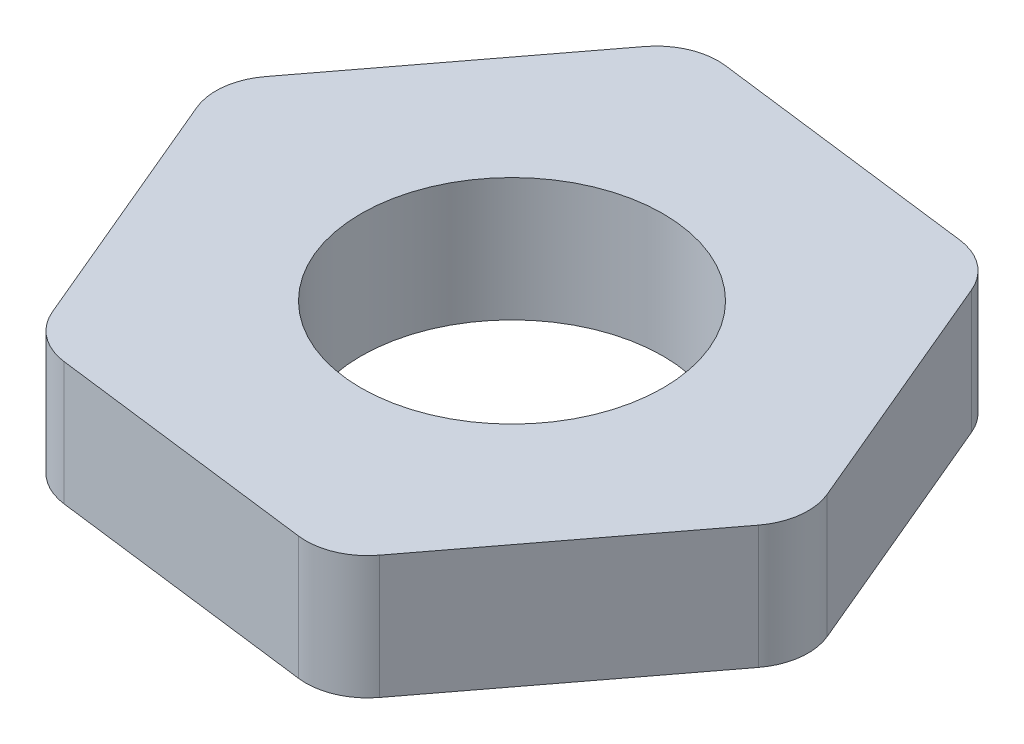
ISO-10303-21;
HEADER;
FILE_DESCRIPTION(('STEP AP214'),'2;1');
FILE_NAME('part.step','',(''),(''),'','','');
FILE_SCHEMA(('AUTOMOTIVE_DESIGN { 1 0 10303 214 1 1 1 1 }'));
ENDSEC;
DATA;
#1=APPLICATION_CONTEXT('core data for automotive mechanical design processes');
#2=APPLICATION_PROTOCOL_DEFINITION('international standard','automotive_design',2000,#1);
#3=PRODUCT_CONTEXT('',#1,'mechanical');
#4=PRODUCT('Part','Part','',(#3));
#5=PRODUCT_RELATED_PRODUCT_CATEGORY('part','',(#4));
#6=PRODUCT_DEFINITION_FORMATION('','',#4);
#7=PRODUCT_DEFINITION_CONTEXT('part definition',#1,'design');
#8=PRODUCT_DEFINITION('design','',#6,#7);
#9=PRODUCT_DEFINITION_SHAPE('','',#8);
#10=(LENGTH_UNIT() NAMED_UNIT(*) SI_UNIT(.MILLI.,.METRE.));
#11=(NAMED_UNIT(*) PLANE_ANGLE_UNIT() SI_UNIT($,.RADIAN.));
#12=(NAMED_UNIT(*) SI_UNIT($,.STERADIAN.) SOLID_ANGLE_UNIT());
#13=UNCERTAINTY_MEASURE_WITH_UNIT(LENGTH_MEASURE(1.E-05),#10,'distance_accuracy_value','');
#14=(GEOMETRIC_REPRESENTATION_CONTEXT(3) GLOBAL_UNCERTAINTY_ASSIGNED_CONTEXT((#13)) GLOBAL_UNIT_ASSIGNED_CONTEXT((#10,
#11,#12)) REPRESENTATION_CONTEXT('',''));
#15=CARTESIAN_POINT('',(0.,0.,0.));
#16=DIRECTION('',(0.,0.,1.));
#17=DIRECTION('',(1.,0.,0.));
#18=AXIS2_PLACEMENT_3D('',#15,#16,#17);
#19=CARTESIAN_POINT('',(0.,1.,0.));
#20=DIRECTION('',(0.,1.,0.));
#21=DIRECTION('',(0.,0.,1.));
#22=AXIS2_PLACEMENT_3D('',#19,#20,#21);
#23=PLANE('',#22);
#24=DIRECTION('',(-0.992143868221456,0.,-0.125102137274172));
#25=VECTOR('',#24,1.);
#26=CARTESIAN_POINT('',(1.675,1.,-2.20779867741604));
#27=LINE('',#26,#25);
#28=CARTESIAN_POINT('',(1.38859273530375,1.,-2.24391255373176));
#29=VERTEX_POINT('',#28);
#30=CARTESIAN_POINT('',(-0.788102476387726,1.,-2.51837801373123));
#31=VERTEX_POINT('',#30);
#32=EDGE_CURVE('E168',#29,#31,#27,.T.);
#33=ORIENTED_EDGE('',*,*,#32,.T.);
#34=CARTESIAN_POINT('',(-0.850653545024812,1.,-2.0223060796205));
#35=DIRECTION('',(0.,1.,0.));
#36=DIRECTION('',(0.,0.,1.));
#37=AXIS2_PLACEMENT_3D('',#34,#35,#36);
#38=CIRCLE('',#37,0.5);
#39=CARTESIAN_POINT('',(-1.24898890775064,1.,-2.32451286114945));
#40=VERTEX_POINT('',#39);
#41=EDGE_CURVE('E191',#31,#40,#38,.T.);
#42=ORIENTED_EDGE('',*,*,#41,.T.);
#43=DIRECTION('',(-0.604413563057889,0.,0.796670725451656));
#44=VECTOR('',#43,1.);
#45=CARTESIAN_POINT('',(-1.07450974108397,1.,-2.55449189004695));
#46=LINE('',#45,#44);
#47=CARTESIAN_POINT('',(-2.57503057441731,1.,-0.576672241528419));
#48=VERTEX_POINT('',#47);
#49=EDGE_CURVE('E144',#40,#48,#46,.T.);
#50=ORIENTED_EDGE('',*,*,#49,.T.);
#51=CARTESIAN_POINT('',(-2.17669521169148,1.,-0.274465459999475));
#52=DIRECTION('',(0.,1.,0.));
#53=DIRECTION('',(0.,0.,1.));
#54=AXIS2_PLACEMENT_3D('',#51,#52,#53);
#55=CIRCLE('',#54,0.5);
#56=CARTESIAN_POINT('',(-2.63758164305439,1.,-0.0806003074176914));
#57=VERTEX_POINT('',#56);
#58=EDGE_CURVE('E189',#48,#57,#55,.T.);
#59=ORIENTED_EDGE('',*,*,#58,.T.);
#60=DIRECTION('',(0.387730305163567,0.,0.921772862725827));
#61=VECTOR('',#60,1.);
#62=CARTESIAN_POINT('',(-2.74950974108397,1.,-0.346693212630916));
#63=LINE('',#62,#61);
#64=CARTESIAN_POINT('',(-1.78692809802958,1.,1.94170577220281));
#65=VERTEX_POINT('',#64);
#66=EDGE_CURVE('E228',#57,#65,#63,.T.);
#67=ORIENTED_EDGE('',*,*,#66,.T.);
#68=CARTESIAN_POINT('',(-1.32604166666667,1.,1.74784061962103));
#69=DIRECTION('',(0.,1.,0.));
#70=DIRECTION('',(0.,0.,1.));
#71=AXIS2_PLACEMENT_3D('',#68,#69,#70);
#72=CIRCLE('',#71,0.5);
#73=CARTESIAN_POINT('',(-1.38859273530375,1.,2.24391255373176));
#74=VERTEX_POINT('',#73);
#75=EDGE_CURVE('E187',#65,#74,#72,.T.);
#76=ORIENTED_EDGE('',*,*,#75,.T.);
#77=DIRECTION('',(0.992143868221456,0.,0.125102137274173));
#78=VECTOR('',#77,1.);
#79=CARTESIAN_POINT('',(-1.675,1.,2.20779867741604));
#80=LINE('',#79,#78);
#81=CARTESIAN_POINT('',(0.788102476387726,1.,2.51837801373123));
#82=VERTEX_POINT('',#81);
#83=EDGE_CURVE('E223',#74,#82,#80,.T.);
#84=ORIENTED_EDGE('',*,*,#83,.T.);
#85=CARTESIAN_POINT('',(0.850653545024812,1.,2.0223060796205));
#86=DIRECTION('',(0.,1.,0.));
#87=DIRECTION('',(0.,0.,1.));
#88=AXIS2_PLACEMENT_3D('',#85,#86,#87);
#89=CIRCLE('',#88,0.5);
#90=CARTESIAN_POINT('',(1.24898890775064,1.,2.32451286114945));
#91=VERTEX_POINT('',#90);
#92=EDGE_CURVE('E185',#82,#91,#89,.T.);
#93=ORIENTED_EDGE('',*,*,#92,.T.);
#94=DIRECTION('',(0.604413563057889,0.,-0.796670725451655));
#95=VECTOR('',#94,1.);
#96=CARTESIAN_POINT('',(1.07450974108397,1.,2.55449189004695));
#97=LINE('',#96,#95);
#98=CARTESIAN_POINT('',(2.57503057441731,1.,0.57667224152842));
#99=VERTEX_POINT('',#98);
#100=EDGE_CURVE('E213',#91,#99,#97,.T.);
#101=ORIENTED_EDGE('',*,*,#100,.T.);
#102=CARTESIAN_POINT('',(2.17669521169148,1.,0.274465459999475));
#103=DIRECTION('',(0.,1.,0.));
#104=DIRECTION('',(0.,0.,1.));
#105=AXIS2_PLACEMENT_3D('',#102,#103,#104);
#106=CIRCLE('',#105,0.5);
#107=CARTESIAN_POINT('',(2.63758164305439,1.,0.0806003074176915));
#108=VERTEX_POINT('',#107);
#109=EDGE_CURVE('E55',#99,#108,#106,.T.);
#110=ORIENTED_EDGE('',*,*,#109,.T.);
#111=DIRECTION('',(-0.387730305163567,0.,-0.921772862725828));
#112=VECTOR('',#111,1.);
#113=CARTESIAN_POINT('',(2.74950974108397,1.,0.346693212630916));
#114=LINE('',#113,#112);
#115=CARTESIAN_POINT('',(1.78692809802958,1.,-1.94170577220281));
#116=VERTEX_POINT('',#115);
#117=EDGE_CURVE('E169',#108,#116,#114,.T.);
#118=ORIENTED_EDGE('',*,*,#117,.T.);
#119=CARTESIAN_POINT('',(1.32604166666667,1.,-1.74784061962103));
#120=DIRECTION('',(0.,1.,0.));
#121=DIRECTION('',(0.,0.,1.));
#122=AXIS2_PLACEMENT_3D('',#119,#120,#121);
#123=CIRCLE('',#122,0.5);
#124=EDGE_CURVE('E182',#116,#29,#123,.T.);
#125=ORIENTED_EDGE('',*,*,#124,.T.);
#126=EDGE_LOOP('',(#33,#42,#50,#59,#67,#76,#84,#93,#101,#110,#118,#125));
#127=FACE_BOUND('',#126,.T.);
#128=CARTESIAN_POINT('',(0.,1.,0.));
#129=DIRECTION('',(0.,1.,0.));
#130=DIRECTION('',(0.,0.,1.));
#131=AXIS2_PLACEMENT_3D('',#128,#129,#130);
#132=CIRCLE('',#131,1.225);
#133=CARTESIAN_POINT('',(0.,1.,1.225));
#134=VERTEX_POINT('',#133);
#135=EDGE_CURVE('E157',#134,#134,#132,.T.);
#136=ORIENTED_EDGE('',*,*,#135,.F.);
#137=EDGE_LOOP('',(#136));
#138=FACE_BOUND('',#137,.T.);
#139=ADVANCED_FACE('F34',(#127,#138),#23,.T.);
#140=CARTESIAN_POINT('',(0.,0.,0.));
#141=DIRECTION('',(0.,1.,0.));
#142=DIRECTION('',(0.,0.,1.));
#143=AXIS2_PLACEMENT_3D('',#140,#141,#142);
#144=PLANE('',#143);
#145=DIRECTION('',(-0.604413563057889,0.,0.796670725451656));
#146=VECTOR('',#145,1.);
#147=CARTESIAN_POINT('',(-1.07450974108397,0.,-2.55449189004695));
#148=LINE('',#147,#146);
#149=CARTESIAN_POINT('',(-1.24898890775064,0.,-2.32451286114945));
#150=VERTEX_POINT('',#149);
#151=CARTESIAN_POINT('',(-2.57503057441731,0.,-0.576672241528419));
#152=VERTEX_POINT('',#151);
#153=EDGE_CURVE('E141',#150,#152,#148,.T.);
#154=ORIENTED_EDGE('',*,*,#153,.F.);
#155=CARTESIAN_POINT('',(-0.850653545024812,0.,-2.0223060796205));
#156=DIRECTION('',(0.,1.,0.));
#157=DIRECTION('',(0.,0.,1.));
#158=AXIS2_PLACEMENT_3D('',#155,#156,#157);
#159=CIRCLE('',#158,0.5);
#160=CARTESIAN_POINT('',(-0.788102476387726,0.,-2.51837801373123));
#161=VERTEX_POINT('',#160);
#162=EDGE_CURVE('E124',#150,#161,#159,.F.);
#163=ORIENTED_EDGE('',*,*,#162,.T.);
#164=DIRECTION('',(-0.992143868221456,0.,-0.125102137274172));
#165=VECTOR('',#164,1.);
#166=CARTESIAN_POINT('',(1.675,0.,-2.20779867741604));
#167=LINE('',#166,#165);
#168=CARTESIAN_POINT('',(1.38859273530375,0.,-2.24391255373176));
#169=VERTEX_POINT('',#168);
#170=EDGE_CURVE('E152',#169,#161,#167,.T.);
#171=ORIENTED_EDGE('',*,*,#170,.F.);
#172=CARTESIAN_POINT('',(1.32604166666667,0.,-1.74784061962103));
#173=DIRECTION('',(0.,1.,0.));
#174=DIRECTION('',(0.,0.,1.));
#175=AXIS2_PLACEMENT_3D('',#172,#173,#174);
#176=CIRCLE('',#175,0.5);
#177=CARTESIAN_POINT('',(1.78692809802958,0.,-1.94170577220281));
#178=VERTEX_POINT('',#177);
#179=EDGE_CURVE('E145',#169,#178,#176,.F.);
#180=ORIENTED_EDGE('',*,*,#179,.T.);
#181=DIRECTION('',(-0.387730305163567,0.,-0.921772862725828));
#182=VECTOR('',#181,1.);
#183=CARTESIAN_POINT('',(2.74950974108397,0.,0.346693212630916));
#184=LINE('',#183,#182);
#185=CARTESIAN_POINT('',(2.63758164305439,0.,0.0806003074176915));
#186=VERTEX_POINT('',#185);
#187=EDGE_CURVE('E166',#186,#178,#184,.T.);
#188=ORIENTED_EDGE('',*,*,#187,.F.);
#189=CARTESIAN_POINT('',(2.17669521169148,0.,0.274465459999475));
#190=DIRECTION('',(0.,1.,0.));
#191=DIRECTION('',(0.,0.,1.));
#192=AXIS2_PLACEMENT_3D('',#189,#190,#191);
#193=CIRCLE('',#192,0.5);
#194=CARTESIAN_POINT('',(2.57503057441731,0.,0.57667224152842));
#195=VERTEX_POINT('',#194);
#196=EDGE_CURVE('E172',#186,#195,#193,.F.);
#197=ORIENTED_EDGE('',*,*,#196,.T.);
#198=DIRECTION('',(0.604413563057889,0.,-0.796670725451655));
#199=VECTOR('',#198,1.);
#200=CARTESIAN_POINT('',(1.07450974108397,0.,2.55449189004695));
#201=LINE('',#200,#199);
#202=CARTESIAN_POINT('',(1.24898890775064,0.,2.32451286114945));
#203=VERTEX_POINT('',#202);
#204=EDGE_CURVE('E163',#203,#195,#201,.T.);
#205=ORIENTED_EDGE('',*,*,#204,.F.);
#206=CARTESIAN_POINT('',(0.850653545024812,0.,2.0223060796205));
#207=DIRECTION('',(0.,1.,0.));
#208=DIRECTION('',(0.,0.,1.));
#209=AXIS2_PLACEMENT_3D('',#206,#207,#208);
#210=CIRCLE('',#209,0.5);
#211=CARTESIAN_POINT('',(0.788102476387726,0.,2.51837801373123));
#212=VERTEX_POINT('',#211);
#213=EDGE_CURVE('E174',#203,#212,#210,.F.);
#214=ORIENTED_EDGE('',*,*,#213,.T.);
#215=DIRECTION('',(0.992143868221456,0.,0.125102137274173));
#216=VECTOR('',#215,1.);
#217=CARTESIAN_POINT('',(-1.675,0.,2.20779867741604));
#218=LINE('',#217,#216);
#219=CARTESIAN_POINT('',(-1.38859273530375,0.,2.24391255373176));
#220=VERTEX_POINT('',#219);
#221=EDGE_CURVE('E155',#220,#212,#218,.T.);
#222=ORIENTED_EDGE('',*,*,#221,.F.);
#223=CARTESIAN_POINT('',(-1.32604166666667,0.,1.74784061962103));
#224=DIRECTION('',(0.,1.,0.));
#225=DIRECTION('',(0.,0.,1.));
#226=AXIS2_PLACEMENT_3D('',#223,#224,#225);
#227=CIRCLE('',#226,0.5);
#228=CARTESIAN_POINT('',(-1.78692809802958,0.,1.94170577220281));
#229=VERTEX_POINT('',#228);
#230=EDGE_CURVE('E176',#220,#229,#227,.F.);
#231=ORIENTED_EDGE('',*,*,#230,.T.);
#232=DIRECTION('',(0.387730305163567,0.,0.921772862725827));
#233=VECTOR('',#232,1.);
#234=CARTESIAN_POINT('',(-2.74950974108397,0.,-0.346693212630916));
#235=LINE('',#234,#233);
#236=CARTESIAN_POINT('',(-2.63758164305439,0.,-0.0806003074176914));
#237=VERTEX_POINT('',#236);
#238=EDGE_CURVE('E151',#237,#229,#235,.T.);
#239=ORIENTED_EDGE('',*,*,#238,.F.);
#240=CARTESIAN_POINT('',(-2.17669521169148,0.,-0.274465459999475));
#241=DIRECTION('',(0.,1.,0.));
#242=DIRECTION('',(0.,0.,1.));
#243=AXIS2_PLACEMENT_3D('',#240,#241,#242);
#244=CIRCLE('',#243,0.5);
#245=EDGE_CURVE('E135',#237,#152,#244,.F.);
#246=ORIENTED_EDGE('',*,*,#245,.T.);
#247=EDGE_LOOP('',(#154,#163,#171,#180,#188,#197,#205,#214,#222,#231,#239,#246));
#248=FACE_BOUND('',#247,.T.);
#249=CARTESIAN_POINT('',(0.,0.,0.));
#250=DIRECTION('',(0.,1.,0.));
#251=DIRECTION('',(0.,0.,1.));
#252=AXIS2_PLACEMENT_3D('',#249,#250,#251);
#253=CIRCLE('',#252,1.225);
#254=CARTESIAN_POINT('',(0.,0.,1.225));
#255=VERTEX_POINT('',#254);
#256=EDGE_CURVE('E234',#255,#255,#253,.T.);
#257=ORIENTED_EDGE('',*,*,#256,.T.);
#258=EDGE_LOOP('',(#257));
#259=FACE_BOUND('',#258,.T.);
#260=ADVANCED_FACE('F148',(#248,#259),#144,.F.);
#261=CARTESIAN_POINT('',(1.675,1.,-2.20779867741604));
#262=DIRECTION('',(-0.125102137274172,0.,0.992143868221456));
#263=DIRECTION('',(0.992143868221456,0.,0.125102137274172));
#264=AXIS2_PLACEMENT_3D('',#261,#262,#263);
#265=PLANE('',#264);
#266=ORIENTED_EDGE('',*,*,#170,.T.);
#267=DIRECTION('',(0.,-1.,0.));
#268=VECTOR('',#267,1.);
#269=CARTESIAN_POINT('',(-0.788102476387726,1.,-2.51837801373123));
#270=LINE('',#269,#268);
#271=EDGE_CURVE('E129',#161,#31,#270,.F.);
#272=ORIENTED_EDGE('',*,*,#271,.T.);
#273=ORIENTED_EDGE('',*,*,#32,.F.);
#274=DIRECTION('',(0.,-1.,0.));
#275=VECTOR('',#274,1.);
#276=CARTESIAN_POINT('',(1.38859273530375,1.,-2.24391255373176));
#277=LINE('',#276,#275);
#278=EDGE_CURVE('E134',#29,#169,#277,.T.);
#279=ORIENTED_EDGE('',*,*,#278,.T.);
#280=EDGE_LOOP('',(#266,#272,#273,#279));
#281=FACE_BOUND('',#280,.T.);
#282=ADVANCED_FACE('F248',(#281),#265,.F.);
#283=CARTESIAN_POINT('',(-1.07450974108397,1.,-2.55449189004695));
#284=DIRECTION('',(0.796670725451656,0.,0.604413563057889));
#285=DIRECTION('',(0.604413563057889,0.,-0.796670725451656));
#286=AXIS2_PLACEMENT_3D('',#283,#284,#285);
#287=PLANE('',#286);
#288=ORIENTED_EDGE('',*,*,#49,.F.);
#289=DIRECTION('',(0.,-1.,0.));
#290=VECTOR('',#289,1.);
#291=CARTESIAN_POINT('',(-1.24898890775064,1.,-2.32451286114945));
#292=LINE('',#291,#290);
#293=EDGE_CURVE('E128',#40,#150,#292,.T.);
#294=ORIENTED_EDGE('',*,*,#293,.T.);
#295=ORIENTED_EDGE('',*,*,#153,.T.);
#296=DIRECTION('',(0.,-1.,0.));
#297=VECTOR('',#296,1.);
#298=CARTESIAN_POINT('',(-2.57503057441731,1.,-0.576672241528419));
#299=LINE('',#298,#297);
#300=EDGE_CURVE('E146',#152,#48,#299,.F.);
#301=ORIENTED_EDGE('',*,*,#300,.T.);
#302=EDGE_LOOP('',(#288,#294,#295,#301));
#303=FACE_BOUND('',#302,.T.);
#304=ADVANCED_FACE('F140',(#303),#287,.F.);
#305=CARTESIAN_POINT('',(-2.74950974108397,1.,-0.346693212630916));
#306=DIRECTION('',(0.921772862725828,0.,-0.387730305163567));
#307=DIRECTION('',(-0.387730305163567,0.,-0.921772862725828));
#308=AXIS2_PLACEMENT_3D('',#305,#306,#307);
#309=PLANE('',#308);
#310=ORIENTED_EDGE('',*,*,#66,.F.);
#311=DIRECTION('',(0.,-1.,0.));
#312=VECTOR('',#311,1.);
#313=CARTESIAN_POINT('',(-2.63758164305439,1.,-0.0806003074176913));
#314=LINE('',#313,#312);
#315=EDGE_CURVE('E195',#57,#237,#314,.T.);
#316=ORIENTED_EDGE('',*,*,#315,.T.);
#317=ORIENTED_EDGE('',*,*,#238,.T.);
#318=DIRECTION('',(0.,-1.,0.));
#319=VECTOR('',#318,1.);
#320=CARTESIAN_POINT('',(-1.78692809802958,1.,1.94170577220281));
#321=LINE('',#320,#319);
#322=EDGE_CURVE('E193',#229,#65,#321,.F.);
#323=ORIENTED_EDGE('',*,*,#322,.T.);
#324=EDGE_LOOP('',(#310,#316,#317,#323));
#325=FACE_BOUND('',#324,.T.);
#326=ADVANCED_FACE('F259',(#325),#309,.F.);
#327=CARTESIAN_POINT('',(-1.675,1.,2.20779867741604));
#328=DIRECTION('',(0.125102137274173,0.,-0.992143868221456));
#329=DIRECTION('',(-0.992143868221456,0.,-0.125102137274173));
#330=AXIS2_PLACEMENT_3D('',#327,#328,#329);
#331=PLANE('',#330);
#332=ORIENTED_EDGE('',*,*,#83,.F.);
#333=DIRECTION('',(0.,-1.,0.));
#334=VECTOR('',#333,1.);
#335=CARTESIAN_POINT('',(-1.38859273530375,1.,2.24391255373176));
#336=LINE('',#335,#334);
#337=EDGE_CURVE('E200',#74,#220,#336,.T.);
#338=ORIENTED_EDGE('',*,*,#337,.T.);
#339=ORIENTED_EDGE('',*,*,#221,.T.);
#340=DIRECTION('',(0.,-1.,0.));
#341=VECTOR('',#340,1.);
#342=CARTESIAN_POINT('',(0.788102476387726,1.,2.51837801373123));
#343=LINE('',#342,#341);
#344=EDGE_CURVE('E198',#212,#82,#343,.F.);
#345=ORIENTED_EDGE('',*,*,#344,.T.);
#346=EDGE_LOOP('',(#332,#338,#339,#345));
#347=FACE_BOUND('',#346,.T.);
#348=ADVANCED_FACE('F256',(#347),#331,.F.);
#349=CARTESIAN_POINT('',(1.07450974108397,1.,2.55449189004695));
#350=DIRECTION('',(-0.796670725451655,0.,-0.604413563057889));
#351=DIRECTION('',(-0.604413563057889,0.,0.796670725451655));
#352=AXIS2_PLACEMENT_3D('',#349,#350,#351);
#353=PLANE('',#352);
#354=ORIENTED_EDGE('',*,*,#100,.F.);
#355=DIRECTION('',(0.,-1.,0.));
#356=VECTOR('',#355,1.);
#357=CARTESIAN_POINT('',(1.24898890775064,1.,2.32451286114945));
#358=LINE('',#357,#356);
#359=EDGE_CURVE('E205',#91,#203,#358,.T.);
#360=ORIENTED_EDGE('',*,*,#359,.T.);
#361=ORIENTED_EDGE('',*,*,#204,.T.);
#362=DIRECTION('',(0.,-1.,0.));
#363=VECTOR('',#362,1.);
#364=CARTESIAN_POINT('',(2.57503057441731,1.,0.57667224152842));
#365=LINE('',#364,#363);
#366=EDGE_CURVE('E203',#195,#99,#365,.F.);
#367=ORIENTED_EDGE('',*,*,#366,.T.);
#368=EDGE_LOOP('',(#354,#360,#361,#367));
#369=FACE_BOUND('',#368,.T.);
#370=ADVANCED_FACE('F211',(#369),#353,.F.);
#371=CARTESIAN_POINT('',(2.74950974108397,1.,0.346693212630916));
#372=DIRECTION('',(-0.921772862725828,0.,0.387730305163567));
#373=DIRECTION('',(0.387730305163567,0.,0.921772862725828));
#374=AXIS2_PLACEMENT_3D('',#371,#372,#373);
#375=PLANE('',#374);
#376=ORIENTED_EDGE('',*,*,#117,.F.);
#377=DIRECTION('',(0.,-1.,0.));
#378=VECTOR('',#377,1.);
#379=CARTESIAN_POINT('',(2.63758164305439,1.,0.0806003074176915));
#380=LINE('',#379,#378);
#381=EDGE_CURVE('E11',#108,#186,#380,.T.);
#382=ORIENTED_EDGE('',*,*,#381,.T.);
#383=ORIENTED_EDGE('',*,*,#187,.T.);
#384=DIRECTION('',(0.,-1.,0.));
#385=VECTOR('',#384,1.);
#386=CARTESIAN_POINT('',(1.78692809802958,1.,-1.94170577220281));
#387=LINE('',#386,#385);
#388=EDGE_CURVE('E42',#178,#116,#387,.F.);
#389=ORIENTED_EDGE('',*,*,#388,.T.);
#390=EDGE_LOOP('',(#376,#382,#383,#389));
#391=FACE_BOUND('',#390,.T.);
#392=ADVANCED_FACE('F221',(#391),#375,.F.);
#393=CARTESIAN_POINT('',(0.,1.,0.));
#394=DIRECTION('',(0.,-1.,0.));
#395=DIRECTION('',(0.,0.,-1.));
#396=AXIS2_PLACEMENT_3D('',#393,#394,#395);
#397=CYLINDRICAL_SURFACE('',#396,1.225);
#398=ORIENTED_EDGE('',*,*,#135,.T.);
#399=EDGE_LOOP('',(#398));
#400=FACE_BOUND('',#399,.T.);
#401=ORIENTED_EDGE('',*,*,#256,.F.);
#402=EDGE_LOOP('',(#401));
#403=FACE_BOUND('',#402,.T.);
#404=ADVANCED_FACE('F240',(#400,#403),#397,.F.);
#405=CARTESIAN_POINT('',(-0.850653545024812,1.,-2.0223060796205));
#406=DIRECTION('',(0.,-1.,0.));
#407=DIRECTION('',(0.,0.,-1.));
#408=AXIS2_PLACEMENT_3D('',#405,#406,#407);
#409=CYLINDRICAL_SURFACE('',#408,0.5);
#410=ORIENTED_EDGE('',*,*,#41,.F.);
#411=ORIENTED_EDGE('',*,*,#271,.F.);
#412=ORIENTED_EDGE('',*,*,#162,.F.);
#413=ORIENTED_EDGE('',*,*,#293,.F.);
#414=EDGE_LOOP('',(#410,#411,#412,#413));
#415=FACE_BOUND('',#414,.T.);
#416=ADVANCED_FACE('F127',(#415),#409,.T.);
#417=CARTESIAN_POINT('',(-2.17669521169148,1.,-0.274465459999475));
#418=DIRECTION('',(0.,-1.,0.));
#419=DIRECTION('',(0.,0.,-1.));
#420=AXIS2_PLACEMENT_3D('',#417,#418,#419);
#421=CYLINDRICAL_SURFACE('',#420,0.5);
#422=ORIENTED_EDGE('',*,*,#58,.F.);
#423=ORIENTED_EDGE('',*,*,#300,.F.);
#424=ORIENTED_EDGE('',*,*,#245,.F.);
#425=ORIENTED_EDGE('',*,*,#315,.F.);
#426=EDGE_LOOP('',(#422,#423,#424,#425));
#427=FACE_BOUND('',#426,.T.);
#428=ADVANCED_FACE('F271',(#427),#421,.T.);
#429=CARTESIAN_POINT('',(-1.32604166666667,1.,1.74784061962103));
#430=DIRECTION('',(0.,-1.,0.));
#431=DIRECTION('',(0.,0.,-1.));
#432=AXIS2_PLACEMENT_3D('',#429,#430,#431);
#433=CYLINDRICAL_SURFACE('',#432,0.5);
#434=ORIENTED_EDGE('',*,*,#75,.F.);
#435=ORIENTED_EDGE('',*,*,#322,.F.);
#436=ORIENTED_EDGE('',*,*,#230,.F.);
#437=ORIENTED_EDGE('',*,*,#337,.F.);
#438=EDGE_LOOP('',(#434,#435,#436,#437));
#439=FACE_BOUND('',#438,.T.);
#440=ADVANCED_FACE('F274',(#439),#433,.T.);
#441=CARTESIAN_POINT('',(0.850653545024812,1.,2.0223060796205));
#442=DIRECTION('',(0.,-1.,0.));
#443=DIRECTION('',(0.,0.,-1.));
#444=AXIS2_PLACEMENT_3D('',#441,#442,#443);
#445=CYLINDRICAL_SURFACE('',#444,0.5);
#446=ORIENTED_EDGE('',*,*,#92,.F.);
#447=ORIENTED_EDGE('',*,*,#344,.F.);
#448=ORIENTED_EDGE('',*,*,#213,.F.);
#449=ORIENTED_EDGE('',*,*,#359,.F.);
#450=EDGE_LOOP('',(#446,#447,#448,#449));
#451=FACE_BOUND('',#450,.T.);
#452=ADVANCED_FACE('F278',(#451),#445,.T.);
#453=CARTESIAN_POINT('',(2.17669521169148,1.,0.274465459999475));
#454=DIRECTION('',(0.,-1.,0.));
#455=DIRECTION('',(0.,0.,-1.));
#456=AXIS2_PLACEMENT_3D('',#453,#454,#455);
#457=CYLINDRICAL_SURFACE('',#456,0.5);
#458=ORIENTED_EDGE('',*,*,#109,.F.);
#459=ORIENTED_EDGE('',*,*,#366,.F.);
#460=ORIENTED_EDGE('',*,*,#196,.F.);
#461=ORIENTED_EDGE('',*,*,#381,.F.);
#462=EDGE_LOOP('',(#458,#459,#460,#461));
#463=FACE_BOUND('',#462,.T.);
#464=ADVANCED_FACE('F220',(#463),#457,.T.);
#465=CARTESIAN_POINT('',(1.32604166666667,1.,-1.74784061962103));
#466=DIRECTION('',(0.,-1.,0.));
#467=DIRECTION('',(0.,0.,-1.));
#468=AXIS2_PLACEMENT_3D('',#465,#466,#467);
#469=CYLINDRICAL_SURFACE('',#468,0.5);
#470=ORIENTED_EDGE('',*,*,#124,.F.);
#471=ORIENTED_EDGE('',*,*,#388,.F.);
#472=ORIENTED_EDGE('',*,*,#179,.F.);
#473=ORIENTED_EDGE('',*,*,#278,.F.);
#474=EDGE_LOOP('',(#470,#471,#472,#473));
#475=FACE_BOUND('',#474,.T.);
#476=ADVANCED_FACE('F36',(#475),#469,.T.);
#477=CLOSED_SHELL('',(#139,#260,#282,#304,#326,#348,#370,#392,#404,#416,#428,#440,#452,#464,#476));
#478=MANIFOLD_SOLID_BREP('B2',#477);
#479=ADVANCED_BREP_SHAPE_REPRESENTATION('',(#18,#478),#14);
#480=SHAPE_DEFINITION_REPRESENTATION(#9,#479);
ENDSEC;
END-ISO-10303-21;
